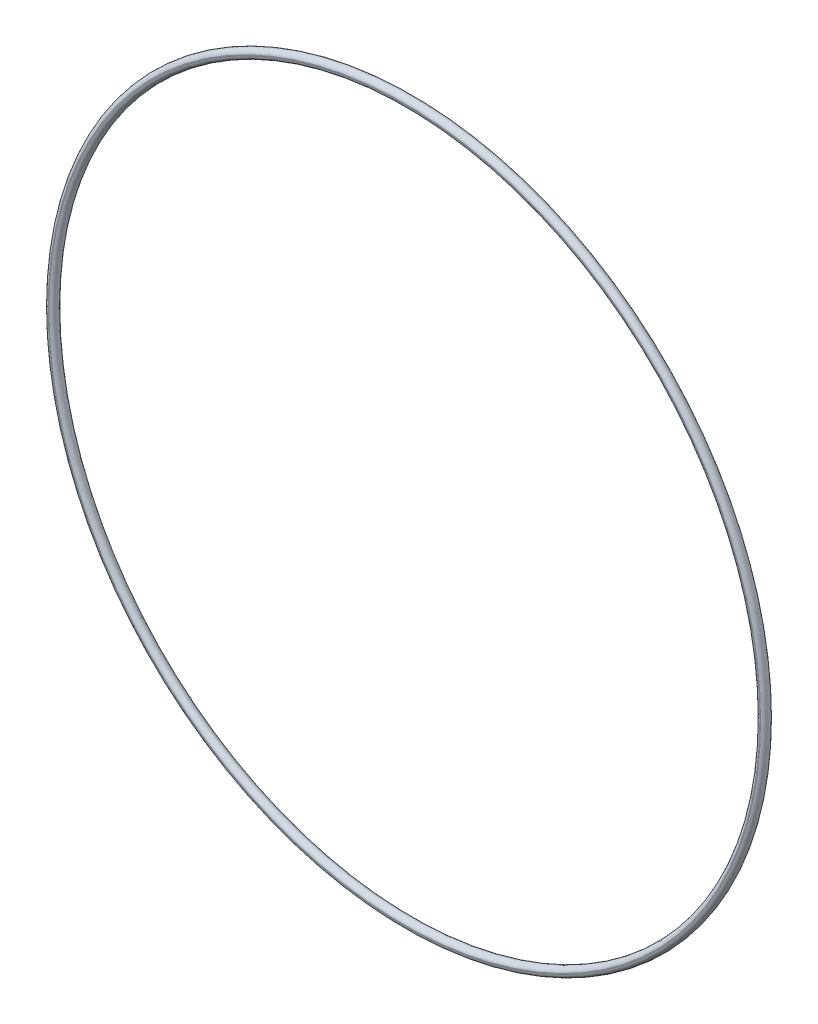
ISO-10303-21;
HEADER;
FILE_DESCRIPTION(('STEP AP214'),'2;1');
FILE_NAME('part.step','',(''),(''),'','','');
FILE_SCHEMA(('AUTOMOTIVE_DESIGN { 1 0 10303 214 1 1 1 1 }'));
ENDSEC;
DATA;
#1=APPLICATION_CONTEXT('core data for automotive mechanical design processes');
#2=APPLICATION_PROTOCOL_DEFINITION('international standard','automotive_design',2000,#1);
#3=PRODUCT_CONTEXT('',#1,'mechanical');
#4=PRODUCT('Part','Part','',(#3));
#5=PRODUCT_RELATED_PRODUCT_CATEGORY('part','',(#4));
#6=PRODUCT_DEFINITION_FORMATION('','',#4);
#7=PRODUCT_DEFINITION_CONTEXT('part definition',#1,'design');
#8=PRODUCT_DEFINITION('design','',#6,#7);
#9=PRODUCT_DEFINITION_SHAPE('','',#8);
#10=(LENGTH_UNIT() NAMED_UNIT(*) SI_UNIT(.MILLI.,.METRE.));
#11=(NAMED_UNIT(*) PLANE_ANGLE_UNIT() SI_UNIT($,.RADIAN.));
#12=(NAMED_UNIT(*) SI_UNIT($,.STERADIAN.) SOLID_ANGLE_UNIT());
#13=UNCERTAINTY_MEASURE_WITH_UNIT(LENGTH_MEASURE(1.E-05),#10,'distance_accuracy_value','');
#14=(GEOMETRIC_REPRESENTATION_CONTEXT(3) GLOBAL_UNCERTAINTY_ASSIGNED_CONTEXT((#13)) GLOBAL_UNIT_ASSIGNED_CONTEXT((#10,
#11,#12)) REPRESENTATION_CONTEXT('',''));
#15=CARTESIAN_POINT('',(0.,0.,0.));
#16=DIRECTION('',(0.,0.,1.));
#17=DIRECTION('',(1.,0.,0.));
#18=AXIS2_PLACEMENT_3D('',#15,#16,#17);
#19=CARTESIAN_POINT('',(0.,0.,0.));
#20=DIRECTION('',(0.,0.,1.));
#21=DIRECTION('',(1.,0.,0.));
#22=AXIS2_PLACEMENT_3D('',#19,#20,#21);
#23=TOROIDAL_SURFACE('',#22,99.568,1.30810000000001);
#24=CARTESIAN_POINT('',(0.,0.,1.30369659229057));
#25=DIRECTION('',(0.,0.,1.));
#26=DIRECTION('',(1.,0.,0.));
#27=AXIS2_PLACEMENT_3D('',#24,#25,#26);
#28=CIRCLE('',#27,99.4607581926207);
#29=CARTESIAN_POINT('',(99.4607581926207,0.,1.30369659229057));
#30=VERTEX_POINT('',#29);
#31=EDGE_CURVE('E10',#30,#30,#28,.T.);
#32=ORIENTED_EDGE('',*,*,#31,.T.);
#33=EDGE_LOOP('',(#32));
#34=FACE_BOUND('',#33,.T.);
#35=CARTESIAN_POINT('',(0.,0.,-1.30369659229057));
#36=DIRECTION('',(0.,0.,1.));
#37=DIRECTION('',(1.,0.,0.));
#38=AXIS2_PLACEMENT_3D('',#35,#36,#37);
#39=CIRCLE('',#38,99.4607581926207);
#40=CARTESIAN_POINT('',(99.4607581926207,0.,-1.30369659229057));
#41=VERTEX_POINT('',#40);
#42=EDGE_CURVE('E54',#41,#41,#39,.T.);
#43=ORIENTED_EDGE('',*,*,#42,.F.);
#44=EDGE_LOOP('',(#43));
#45=FACE_BOUND('',#44,.T.);
#46=ADVANCED_FACE('F37',(#34,#45),#23,.T.);
#47=CARTESIAN_POINT('',(0.,0.,1.30369659229057));
#48=DIRECTION('',(0.,0.,1.));
#49=DIRECTION('',(1.,0.,0.));
#50=AXIS2_PLACEMENT_3D('',#47,#48,#49);
#51=PLANE('',#50);
#52=CARTESIAN_POINT('',(0.,0.,1.30369659229057));
#53=DIRECTION('',(0.,0.,1.));
#54=DIRECTION('',(1.,0.,0.));
#55=AXIS2_PLACEMENT_3D('',#52,#53,#54);
#56=CIRCLE('',#55,99.6752418073793);
#57=CARTESIAN_POINT('',(99.6752418073793,0.,1.30369659229057));
#58=VERTEX_POINT('',#57);
#59=EDGE_CURVE('E44',#58,#58,#56,.T.);
#60=ORIENTED_EDGE('',*,*,#59,.T.);
#61=EDGE_LOOP('',(#60));
#62=FACE_BOUND('',#61,.T.);
#63=ORIENTED_EDGE('',*,*,#31,.F.);
#64=EDGE_LOOP('',(#63));
#65=FACE_BOUND('',#64,.T.);
#66=ADVANCED_FACE('F64',(#62,#65),#51,.T.);
#67=CARTESIAN_POINT('',(0.,0.,0.));
#68=DIRECTION('',(0.,0.,1.));
#69=DIRECTION('',(1.,0.,0.));
#70=AXIS2_PLACEMENT_3D('',#67,#68,#69);
#71=TOROIDAL_SURFACE('',#70,99.568,1.30810000000001);
#72=CARTESIAN_POINT('',(0.,0.,-1.30369659229057));
#73=DIRECTION('',(0.,0.,1.));
#74=DIRECTION('',(1.,0.,0.));
#75=AXIS2_PLACEMENT_3D('',#72,#73,#74);
#76=CIRCLE('',#75,99.6752418073793);
#77=CARTESIAN_POINT('',(99.6752418073793,0.,-1.30369659229057));
#78=VERTEX_POINT('',#77);
#79=EDGE_CURVE('E49',#78,#78,#76,.T.);
#80=ORIENTED_EDGE('',*,*,#79,.T.);
#81=EDGE_LOOP('',(#80));
#82=FACE_BOUND('',#81,.T.);
#83=ORIENTED_EDGE('',*,*,#59,.F.);
#84=EDGE_LOOP('',(#83));
#85=FACE_BOUND('',#84,.T.);
#86=ADVANCED_FACE('F68',(#82,#85),#71,.T.);
#87=CARTESIAN_POINT('',(0.,0.,-1.30369659229057));
#88=DIRECTION('',(0.,0.,1.));
#89=DIRECTION('',(1.,0.,0.));
#90=AXIS2_PLACEMENT_3D('',#87,#88,#89);
#91=PLANE('',#90);
#92=ORIENTED_EDGE('',*,*,#79,.F.);
#93=EDGE_LOOP('',(#92));
#94=FACE_BOUND('',#93,.T.);
#95=ORIENTED_EDGE('',*,*,#42,.T.);
#96=EDGE_LOOP('',(#95));
#97=FACE_BOUND('',#96,.T.);
#98=ADVANCED_FACE('F61',(#94,#97),#91,.F.);
#99=CLOSED_SHELL('',(#46,#66,#86,#98));
#100=MANIFOLD_SOLID_BREP('B2',#99);
#101=ADVANCED_BREP_SHAPE_REPRESENTATION('',(#18,#100),#14);
#102=SHAPE_DEFINITION_REPRESENTATION(#9,#101);
ENDSEC;
END-ISO-10303-21;
